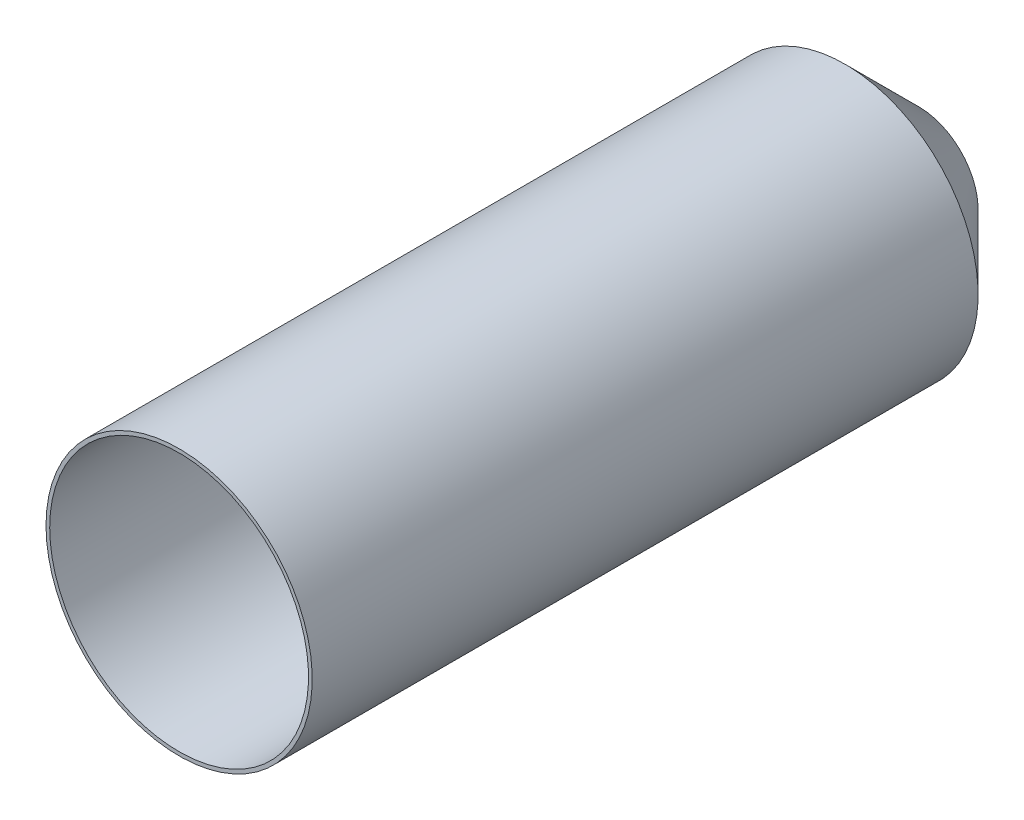
ISO-10303-21;
HEADER;
FILE_DESCRIPTION(('STEP AP214'),'2;1');
FILE_NAME('part.step','',(''),(''),'','','');
FILE_SCHEMA(('AUTOMOTIVE_DESIGN { 1 0 10303 214 1 1 1 1 }'));
ENDSEC;
DATA;
#1=APPLICATION_CONTEXT('core data for automotive mechanical design processes');
#2=APPLICATION_PROTOCOL_DEFINITION('international standard','automotive_design',2000,#1);
#3=PRODUCT_CONTEXT('',#1,'mechanical');
#4=PRODUCT('Part','Part','',(#3));
#5=PRODUCT_RELATED_PRODUCT_CATEGORY('part','',(#4));
#6=PRODUCT_DEFINITION_FORMATION('','',#4);
#7=PRODUCT_DEFINITION_CONTEXT('part definition',#1,'design');
#8=PRODUCT_DEFINITION('design','',#6,#7);
#9=PRODUCT_DEFINITION_SHAPE('','',#8);
#10=(LENGTH_UNIT() NAMED_UNIT(*) SI_UNIT(.MILLI.,.METRE.));
#11=(NAMED_UNIT(*) PLANE_ANGLE_UNIT() SI_UNIT($,.RADIAN.));
#12=(NAMED_UNIT(*) SI_UNIT($,.STERADIAN.) SOLID_ANGLE_UNIT());
#13=UNCERTAINTY_MEASURE_WITH_UNIT(LENGTH_MEASURE(1.E-05),#10,'distance_accuracy_value','');
#14=(GEOMETRIC_REPRESENTATION_CONTEXT(3) GLOBAL_UNCERTAINTY_ASSIGNED_CONTEXT((#13)) GLOBAL_UNIT_ASSIGNED_CONTEXT((#10,
#11,#12)) REPRESENTATION_CONTEXT('',''));
#15=CARTESIAN_POINT('',(0.,0.,0.));
#16=DIRECTION('',(0.,0.,1.));
#17=DIRECTION('',(1.,0.,0.));
#18=AXIS2_PLACEMENT_3D('',#15,#16,#17);
#19=CARTESIAN_POINT('',(0.,0.,2.1094237467878E-12));
#20=DIRECTION('',(0.,0.,-1.));
#21=DIRECTION('',(-1.,0.,0.));
#22=AXIS2_PLACEMENT_3D('',#19,#20,#21);
#23=CYLINDRICAL_SURFACE('',#22,1610.);
#24=CARTESIAN_POINT('',(0.,0.,9.99999998363421E-05));
#25=DIRECTION('',(0.,0.,-1.));
#26=DIRECTION('',(-1.,0.,0.));
#27=AXIS2_PLACEMENT_3D('',#24,#25,#26);
#28=CIRCLE('',#27,1610.);
#29=CARTESIAN_POINT('',(-1610.,0.,9.99999998363421E-05));
#30=VERTEX_POINT('',#29);
#31=EDGE_CURVE('E62',#30,#30,#28,.T.);
#32=ORIENTED_EDGE('',*,*,#31,.T.);
#33=EDGE_LOOP('',(#32));
#34=FACE_BOUND('',#33,.T.);
#35=CARTESIAN_POINT('',(0.,0.,0.));
#36=DIRECTION('',(0.,0.,-1.));
#37=DIRECTION('',(-1.,0.,0.));
#38=AXIS2_PLACEMENT_3D('',#35,#36,#37);
#39=CIRCLE('',#38,1610.);
#40=CARTESIAN_POINT('',(-1610.,0.,0.));
#41=VERTEX_POINT('',#40);
#42=EDGE_CURVE('E10',#41,#41,#39,.T.);
#43=ORIENTED_EDGE('',*,*,#42,.F.);
#44=EDGE_LOOP('',(#43));
#45=FACE_BOUND('',#44,.T.);
#46=ADVANCED_FACE('F34',(#34,#45),#23,.T.);
#47=CARTESIAN_POINT('',(0.,1610.,0.));
#48=DIRECTION('',(0.,0.,-1.));
#49=DIRECTION('',(-1.,0.,0.));
#50=AXIS2_PLACEMENT_3D('',#47,#48,#49);
#51=PLANE('',#50);
#52=ORIENTED_EDGE('',*,*,#42,.T.);
#53=EDGE_LOOP('',(#52));
#54=FACE_BOUND('',#53,.T.);
#55=CARTESIAN_POINT('',(0.,0.,0.));
#56=DIRECTION('',(0.,0.,-1.));
#57=DIRECTION('',(-1.,0.,0.));
#58=AXIS2_PLACEMENT_3D('',#55,#56,#57);
#59=CIRCLE('',#58,1510.);
#60=CARTESIAN_POINT('',(-1510.,0.,0.));
#61=VERTEX_POINT('',#60);
#62=EDGE_CURVE('E40',#61,#61,#59,.T.);
#63=ORIENTED_EDGE('',*,*,#62,.F.);
#64=EDGE_LOOP('',(#63));
#65=FACE_BOUND('',#64,.T.);
#66=ADVANCED_FACE('F80',(#54,#65),#51,.T.);
#67=CARTESIAN_POINT('',(0.,0.,2.1094237467878E-12));
#68=DIRECTION('',(0.,0.,-1.));
#69=DIRECTION('',(-1.,0.,0.));
#70=AXIS2_PLACEMENT_3D('',#67,#68,#69);
#71=CYLINDRICAL_SURFACE('',#70,1510.);
#72=ORIENTED_EDGE('',*,*,#62,.T.);
#73=EDGE_LOOP('',(#72));
#74=FACE_BOUND('',#73,.T.);
#75=CARTESIAN_POINT('',(0.,0.,41.4214562373108));
#76=DIRECTION('',(0.,0.,-1.));
#77=DIRECTION('',(-1.,0.,0.));
#78=AXIS2_PLACEMENT_3D('',#75,#76,#77);
#79=CIRCLE('',#78,1510.);
#80=CARTESIAN_POINT('',(-1510.,0.,41.4214562373108));
#81=VERTEX_POINT('',#80);
#82=EDGE_CURVE('E44',#81,#81,#79,.T.);
#83=ORIENTED_EDGE('',*,*,#82,.F.);
#84=EDGE_LOOP('',(#83));
#85=FACE_BOUND('',#84,.T.);
#86=ADVANCED_FACE('F84',(#74,#85),#71,.F.);
#87=CARTESIAN_POINT('',(0.,0.,2031.4214562373));
#88=DIRECTION('',(0.,0.,1.));
#89=DIRECTION('',(1.,0.,0.));
#90=AXIS2_PLACEMENT_3D('',#87,#88,#89);
#91=CONICAL_SURFACE('',#90,3500.,0.78539816339745);
#92=ORIENTED_EDGE('',*,*,#82,.T.);
#93=EDGE_LOOP('',(#92));
#94=FACE_BOUND('',#93,.T.);
#95=CARTESIAN_POINT('',(0.,0.,2031.4214562373));
#96=DIRECTION('',(0.,0.,-1.));
#97=DIRECTION('',(-1.,0.,0.));
#98=AXIS2_PLACEMENT_3D('',#95,#96,#97);
#99=CIRCLE('',#98,3500.);
#100=CARTESIAN_POINT('',(-3500.,0.,2031.4214562373));
#101=VERTEX_POINT('',#100);
#102=EDGE_CURVE('E48',#101,#101,#99,.T.);
#103=ORIENTED_EDGE('',*,*,#102,.F.);
#104=EDGE_LOOP('',(#103));
#105=FACE_BOUND('',#104,.T.);
#106=ADVANCED_FACE('F88',(#94,#105),#91,.F.);
#107=CARTESIAN_POINT('',(0.,0.,2.1094237467878E-12));
#108=DIRECTION('',(0.,0.,-1.));
#109=DIRECTION('',(-1.,0.,0.));
#110=AXIS2_PLACEMENT_3D('',#107,#108,#109);
#111=CYLINDRICAL_SURFACE('',#110,3500.);
#112=ORIENTED_EDGE('',*,*,#102,.T.);
#113=EDGE_LOOP('',(#112));
#114=FACE_BOUND('',#113,.T.);
#115=CARTESIAN_POINT('',(0.,0.,20000.));
#116=DIRECTION('',(0.,0.,-1.));
#117=DIRECTION('',(-1.,0.,0.));
#118=AXIS2_PLACEMENT_3D('',#115,#116,#117);
#119=CIRCLE('',#118,3500.);
#120=CARTESIAN_POINT('',(-3500.,0.,20000.));
#121=VERTEX_POINT('',#120);
#122=EDGE_CURVE('E53',#121,#121,#119,.T.);
#123=ORIENTED_EDGE('',*,*,#122,.F.);
#124=EDGE_LOOP('',(#123));
#125=FACE_BOUND('',#124,.T.);
#126=ADVANCED_FACE('F94',(#114,#125),#111,.F.);
#127=CARTESIAN_POINT('',(0.,3500.,20000.));
#128=DIRECTION('',(0.,0.,1.));
#129=DIRECTION('',(1.,0.,0.));
#130=AXIS2_PLACEMENT_3D('',#127,#128,#129);
#131=PLANE('',#130);
#132=ORIENTED_EDGE('',*,*,#122,.T.);
#133=EDGE_LOOP('',(#132));
#134=FACE_BOUND('',#133,.T.);
#135=CARTESIAN_POINT('',(0.,0.,20000.));
#136=DIRECTION('',(0.,0.,-1.));
#137=DIRECTION('',(-1.,0.,0.));
#138=AXIS2_PLACEMENT_3D('',#135,#136,#137);
#139=CIRCLE('',#138,3600.);
#140=CARTESIAN_POINT('',(-3600.,0.,20000.));
#141=VERTEX_POINT('',#140);
#142=EDGE_CURVE('E56',#141,#141,#139,.T.);
#143=ORIENTED_EDGE('',*,*,#142,.F.);
#144=EDGE_LOOP('',(#143));
#145=FACE_BOUND('',#144,.T.);
#146=ADVANCED_FACE('F76',(#134,#145),#131,.T.);
#147=CARTESIAN_POINT('',(0.,0.,2.1094237467878E-12));
#148=DIRECTION('',(0.,0.,-1.));
#149=DIRECTION('',(-1.,0.,0.));
#150=AXIS2_PLACEMENT_3D('',#147,#148,#149);
#151=CYLINDRICAL_SURFACE('',#150,3600.);
#152=ORIENTED_EDGE('',*,*,#142,.T.);
#153=EDGE_LOOP('',(#152));
#154=FACE_BOUND('',#153,.T.);
#155=CARTESIAN_POINT('',(0.,0.,1990.0001));
#156=DIRECTION('',(0.,0.,-1.));
#157=DIRECTION('',(-1.,0.,0.));
#158=AXIS2_PLACEMENT_3D('',#155,#156,#157);
#159=CIRCLE('',#158,3600.00000000001);
#160=CARTESIAN_POINT('',(-3600.00000000001,0.,1990.0001));
#161=VERTEX_POINT('',#160);
#162=EDGE_CURVE('E59',#161,#161,#159,.T.);
#163=ORIENTED_EDGE('',*,*,#162,.F.);
#164=EDGE_LOOP('',(#163));
#165=FACE_BOUND('',#164,.T.);
#166=ADVANCED_FACE('F70',(#154,#165),#151,.T.);
#167=CARTESIAN_POINT('',(0.,0.,9.99999998363421E-05));
#168=DIRECTION('',(0.,0.,1.));
#169=DIRECTION('',(1.,0.,0.));
#170=AXIS2_PLACEMENT_3D('',#167,#168,#169);
#171=CONICAL_SURFACE('',#170,1610.,0.78539816339745);
#172=ORIENTED_EDGE('',*,*,#162,.T.);
#173=EDGE_LOOP('',(#172));
#174=FACE_BOUND('',#173,.T.);
#175=ORIENTED_EDGE('',*,*,#31,.F.);
#176=EDGE_LOOP('',(#175));
#177=FACE_BOUND('',#176,.T.);
#178=ADVANCED_FACE('F68',(#174,#177),#171,.T.);
#179=CLOSED_SHELL('',(#46,#66,#86,#106,#126,#146,#166,#178));
#180=MANIFOLD_SOLID_BREP('B2',#179);
#181=ADVANCED_BREP_SHAPE_REPRESENTATION('',(#18,#180),#14);
#182=SHAPE_DEFINITION_REPRESENTATION(#9,#181);
ENDSEC;
END-ISO-10303-21;
